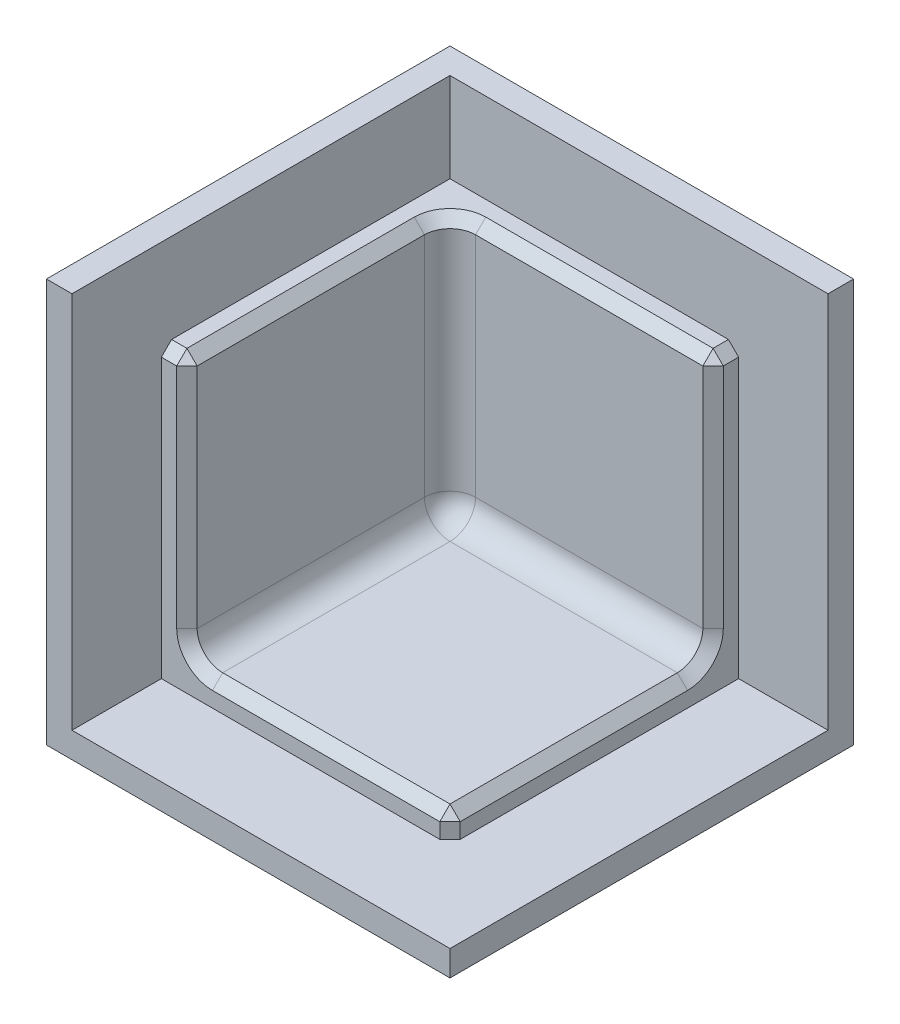
ISO-10303-21;
HEADER;
FILE_DESCRIPTION(('STEP AP214'),'2;1');
FILE_NAME('part.step','',(''),(''),'','','');
FILE_SCHEMA(('AUTOMOTIVE_DESIGN { 1 0 10303 214 1 1 1 1 }'));
ENDSEC;
DATA;
#1=APPLICATION_CONTEXT('core data for automotive mechanical design processes');
#2=APPLICATION_PROTOCOL_DEFINITION('international standard','automotive_design',2000,#1);
#3=PRODUCT_CONTEXT('',#1,'mechanical');
#4=PRODUCT('Part','Part','',(#3));
#5=PRODUCT_RELATED_PRODUCT_CATEGORY('part','',(#4));
#6=PRODUCT_DEFINITION_FORMATION('','',#4);
#7=PRODUCT_DEFINITION_CONTEXT('part definition',#1,'design');
#8=PRODUCT_DEFINITION('design','',#6,#7);
#9=PRODUCT_DEFINITION_SHAPE('','',#8);
#10=(LENGTH_UNIT() NAMED_UNIT(*) SI_UNIT(.MILLI.,.METRE.));
#11=(NAMED_UNIT(*) PLANE_ANGLE_UNIT() SI_UNIT($,.RADIAN.));
#12=(NAMED_UNIT(*) SI_UNIT($,.STERADIAN.) SOLID_ANGLE_UNIT());
#13=UNCERTAINTY_MEASURE_WITH_UNIT(LENGTH_MEASURE(1.E-05),#10,'distance_accuracy_value','');
#14=(GEOMETRIC_REPRESENTATION_CONTEXT(3) GLOBAL_UNCERTAINTY_ASSIGNED_CONTEXT((#13)) GLOBAL_UNIT_ASSIGNED_CONTEXT((#10,
#11,#12)) REPRESENTATION_CONTEXT('',''));
#15=CARTESIAN_POINT('',(0.,0.,0.));
#16=DIRECTION('',(0.,0.,1.));
#17=DIRECTION('',(1.,0.,0.));
#18=AXIS2_PLACEMENT_3D('',#15,#16,#17);
#19=CARTESIAN_POINT('',(7.9,15.8,-7.9));
#20=DIRECTION('',(-1.,0.,0.));
#21=DIRECTION('',(0.,0.,1.));
#22=AXIS2_PLACEMENT_3D('',#19,#20,#21);
#23=PLANE('',#22);
#24=DIRECTION('',(0.,1.,0.));
#25=VECTOR('',#24,1.);
#26=CARTESIAN_POINT('',(7.9,12.3,-6.9));
#27=LINE('',#26,#25);
#28=CARTESIAN_POINT('',(7.9,1.,-6.9));
#29=VERTEX_POINT('',#28);
#30=CARTESIAN_POINT('',(7.9,15.8,-6.9));
#31=VERTEX_POINT('',#30);
#32=EDGE_CURVE('E204',#29,#31,#27,.T.);
#33=ORIENTED_EDGE('',*,*,#32,.F.);
#34=DIRECTION('',(0.,0.,1.));
#35=VECTOR('',#34,1.);
#36=CARTESIAN_POINT('',(7.9,1.,4.4));
#37=LINE('',#36,#35);
#38=CARTESIAN_POINT('',(7.9,1.,7.9));
#39=VERTEX_POINT('',#38);
#40=EDGE_CURVE('E190',#29,#39,#37,.T.);
#41=ORIENTED_EDGE('',*,*,#40,.T.);
#42=DIRECTION('',(0.,-1.,0.));
#43=VECTOR('',#42,1.);
#44=CARTESIAN_POINT('',(7.9,15.8,7.9));
#45=LINE('',#44,#43);
#46=CARTESIAN_POINT('',(7.9,0.,7.9));
#47=VERTEX_POINT('',#46);
#48=EDGE_CURVE('E251',#39,#47,#45,.T.);
#49=ORIENTED_EDGE('',*,*,#48,.T.);
#50=DIRECTION('',(0.,0.,-1.));
#51=VECTOR('',#50,1.);
#52=CARTESIAN_POINT('',(7.9,0.,-7.9));
#53=LINE('',#52,#51);
#54=CARTESIAN_POINT('',(7.9,0.,-7.9));
#55=VERTEX_POINT('',#54);
#56=EDGE_CURVE('E200',#47,#55,#53,.T.);
#57=ORIENTED_EDGE('',*,*,#56,.T.);
#58=DIRECTION('',(0.,-1.,0.));
#59=VECTOR('',#58,1.);
#60=CARTESIAN_POINT('',(7.9,15.8,-7.9));
#61=LINE('',#60,#59);
#62=CARTESIAN_POINT('',(7.9,15.8,-7.9));
#63=VERTEX_POINT('',#62);
#64=EDGE_CURVE('E267',#63,#55,#61,.T.);
#65=ORIENTED_EDGE('',*,*,#64,.F.);
#66=DIRECTION('',(0.,0.,-1.));
#67=VECTOR('',#66,1.);
#68=CARTESIAN_POINT('',(7.9,15.8,-7.9));
#69=LINE('',#68,#67);
#70=EDGE_CURVE('E206',#31,#63,#69,.T.);
#71=ORIENTED_EDGE('',*,*,#70,.F.);
#72=EDGE_LOOP('',(#33,#41,#49,#57,#65,#71));
#73=FACE_BOUND('',#72,.T.);
#74=ADVANCED_FACE('F34',(#73),#23,.F.);
#75=CARTESIAN_POINT('',(-5.9,15.8,-7.9));
#76=DIRECTION('',(1.,0.,0.));
#77=DIRECTION('',(0.,0.,-1.));
#78=AXIS2_PLACEMENT_3D('',#75,#76,#77);
#79=PLANE('',#78);
#80=DIRECTION('',(0.,0.,1.));
#81=VECTOR('',#80,1.);
#82=CARTESIAN_POINT('',(-5.9,11.9,4.4));
#83=LINE('',#82,#81);
#84=CARTESIAN_POINT('',(-5.9,11.9,-4.9));
#85=VERTEX_POINT('',#84);
#86=CARTESIAN_POINT('',(-5.9,11.9,4.));
#87=VERTEX_POINT('',#86);
#88=EDGE_CURVE('E331',#85,#87,#83,.T.);
#89=ORIENTED_EDGE('',*,*,#88,.T.);
#90=DIRECTION('',(0.,-1.,0.));
#91=VECTOR('',#90,1.);
#92=CARTESIAN_POINT('',(-5.9,15.8,4.));
#93=LINE('',#92,#91);
#94=CARTESIAN_POINT('',(-5.9,3.,4.));
#95=VERTEX_POINT('',#94);
#96=EDGE_CURVE('E333',#87,#95,#93,.T.);
#97=ORIENTED_EDGE('',*,*,#96,.T.);
#98=DIRECTION('',(0.,0.,1.));
#99=VECTOR('',#98,1.);
#100=CARTESIAN_POINT('',(-5.9,3.,-5.9));
#101=LINE('',#100,#99);
#102=CARTESIAN_POINT('',(-5.9,3.,-4.9));
#103=VERTEX_POINT('',#102);
#104=EDGE_CURVE('E274',#95,#103,#101,.F.);
#105=ORIENTED_EDGE('',*,*,#104,.T.);
#106=DIRECTION('',(0.,-1.,0.));
#107=VECTOR('',#106,1.);
#108=CARTESIAN_POINT('',(-5.9,12.3,-4.9));
#109=LINE('',#108,#107);
#110=EDGE_CURVE('E276',#103,#85,#109,.F.);
#111=ORIENTED_EDGE('',*,*,#110,.T.);
#112=EDGE_LOOP('',(#89,#97,#105,#111));
#113=FACE_BOUND('',#112,.T.);
#114=ADVANCED_FACE('F416',(#113),#79,.T.);
#115=CARTESIAN_POINT('',(0.,2.,0.));
#116=DIRECTION('',(0.,1.,0.));
#117=DIRECTION('',(0.,0.,1.));
#118=AXIS2_PLACEMENT_3D('',#115,#116,#117);
#119=PLANE('',#118);
#120=DIRECTION('',(0.,0.,1.));
#121=VECTOR('',#120,1.);
#122=CARTESIAN_POINT('',(-4.9,2.,4.4));
#123=LINE('',#122,#121);
#124=CARTESIAN_POINT('',(-4.9,2.,-4.9));
#125=VERTEX_POINT('',#124);
#126=CARTESIAN_POINT('',(-4.9,2.,4.));
#127=VERTEX_POINT('',#126);
#128=EDGE_CURVE('E279',#125,#127,#123,.T.);
#129=ORIENTED_EDGE('',*,*,#128,.T.);
#130=DIRECTION('',(1.,0.,0.));
#131=VECTOR('',#130,1.);
#132=CARTESIAN_POINT('',(0.,2.,4.));
#133=LINE('',#132,#131);
#134=CARTESIAN_POINT('',(4.,2.,4.));
#135=VERTEX_POINT('',#134);
#136=EDGE_CURVE('E316',#127,#135,#133,.T.);
#137=ORIENTED_EDGE('',*,*,#136,.T.);
#138=DIRECTION('',(0.,0.,-1.));
#139=VECTOR('',#138,1.);
#140=CARTESIAN_POINT('',(4.,2.,-4.9));
#141=LINE('',#140,#139);
#142=CARTESIAN_POINT('',(4.,2.,-4.9));
#143=VERTEX_POINT('',#142);
#144=EDGE_CURVE('E314',#135,#143,#141,.T.);
#145=ORIENTED_EDGE('',*,*,#144,.T.);
#146=DIRECTION('',(-1.,0.,0.));
#147=VECTOR('',#146,1.);
#148=CARTESIAN_POINT('',(-5.9,2.,-4.9));
#149=LINE('',#148,#147);
#150=EDGE_CURVE('E282',#143,#125,#149,.T.);
#151=ORIENTED_EDGE('',*,*,#150,.T.);
#152=EDGE_LOOP('',(#129,#137,#145,#151));
#153=FACE_BOUND('',#152,.T.);
#154=ADVANCED_FACE('F470',(#153),#119,.T.);
#155=CARTESIAN_POINT('',(-7.9,15.8,7.9));
#156=DIRECTION('',(0.,0.,-1.));
#157=DIRECTION('',(-1.,0.,0.));
#158=AXIS2_PLACEMENT_3D('',#155,#156,#157);
#159=PLANE('',#158);
#160=ORIENTED_EDGE('',*,*,#48,.F.);
#161=DIRECTION('',(1.,0.,0.));
#162=VECTOR('',#161,1.);
#163=CARTESIAN_POINT('',(-6.9,1.,7.9));
#164=LINE('',#163,#162);
#165=CARTESIAN_POINT('',(-6.9,1.,7.9));
#166=VERTEX_POINT('',#165);
#167=EDGE_CURVE('E197',#166,#39,#164,.T.);
#168=ORIENTED_EDGE('',*,*,#167,.F.);
#169=DIRECTION('',(0.,-1.,0.));
#170=VECTOR('',#169,1.);
#171=CARTESIAN_POINT('',(-6.9,15.8,7.9));
#172=LINE('',#171,#170);
#173=CARTESIAN_POINT('',(-6.9,15.8,7.9));
#174=VERTEX_POINT('',#173);
#175=EDGE_CURVE('E229',#174,#166,#172,.T.);
#176=ORIENTED_EDGE('',*,*,#175,.F.);
#177=DIRECTION('',(1.,0.,0.));
#178=VECTOR('',#177,1.);
#179=CARTESIAN_POINT('',(-7.9,15.8,7.9));
#180=LINE('',#179,#178);
#181=CARTESIAN_POINT('',(-7.9,15.8,7.9));
#182=VERTEX_POINT('',#181);
#183=EDGE_CURVE('E248',#182,#174,#180,.T.);
#184=ORIENTED_EDGE('',*,*,#183,.F.);
#185=DIRECTION('',(0.,-1.,0.));
#186=VECTOR('',#185,1.);
#187=CARTESIAN_POINT('',(-7.9,15.8,7.9));
#188=LINE('',#187,#186);
#189=CARTESIAN_POINT('',(-7.9,0.,7.9));
#190=VERTEX_POINT('',#189);
#191=EDGE_CURVE('E261',#182,#190,#188,.T.);
#192=ORIENTED_EDGE('',*,*,#191,.T.);
#193=DIRECTION('',(1.,0.,0.));
#194=VECTOR('',#193,1.);
#195=CARTESIAN_POINT('',(-7.9,0.,7.9));
#196=LINE('',#195,#194);
#197=EDGE_CURVE('E244',#190,#47,#196,.T.);
#198=ORIENTED_EDGE('',*,*,#197,.T.);
#199=EDGE_LOOP('',(#160,#168,#176,#184,#192,#198));
#200=FACE_BOUND('',#199,.T.);
#201=ADVANCED_FACE('F656',(#200),#159,.F.);
#202=CARTESIAN_POINT('',(-7.9,15.8,-7.9));
#203=DIRECTION('',(0.,0.,1.));
#204=DIRECTION('',(1.,0.,0.));
#205=AXIS2_PLACEMENT_3D('',#202,#203,#204);
#206=PLANE('',#205);
#207=DIRECTION('',(-1.,0.,0.));
#208=VECTOR('',#207,1.);
#209=CARTESIAN_POINT('',(-7.9,0.,-7.9));
#210=LINE('',#209,#208);
#211=CARTESIAN_POINT('',(-7.9,0.,-7.9));
#212=VERTEX_POINT('',#211);
#213=EDGE_CURVE('E254',#55,#212,#210,.T.);
#214=ORIENTED_EDGE('',*,*,#213,.T.);
#215=DIRECTION('',(0.,-1.,0.));
#216=VECTOR('',#215,1.);
#217=CARTESIAN_POINT('',(-7.9,15.8,-7.9));
#218=LINE('',#217,#216);
#219=CARTESIAN_POINT('',(-7.9,15.8,-7.9));
#220=VERTEX_POINT('',#219);
#221=EDGE_CURVE('E264',#220,#212,#218,.T.);
#222=ORIENTED_EDGE('',*,*,#221,.F.);
#223=DIRECTION('',(-1.,0.,0.));
#224=VECTOR('',#223,1.);
#225=CARTESIAN_POINT('',(-7.9,15.8,-7.9));
#226=LINE('',#225,#224);
#227=EDGE_CURVE('E243',#63,#220,#226,.T.);
#228=ORIENTED_EDGE('',*,*,#227,.F.);
#229=ORIENTED_EDGE('',*,*,#64,.T.);
#230=EDGE_LOOP('',(#214,#222,#228,#229));
#231=FACE_BOUND('',#230,.T.);
#232=ADVANCED_FACE('F474',(#231),#206,.F.);
#233=CARTESIAN_POINT('',(-7.9,15.8,-7.9));
#234=DIRECTION('',(1.,0.,0.));
#235=DIRECTION('',(0.,0.,-1.));
#236=AXIS2_PLACEMENT_3D('',#233,#234,#235);
#237=PLANE('',#236);
#238=DIRECTION('',(0.,0.,1.));
#239=VECTOR('',#238,1.);
#240=CARTESIAN_POINT('',(-7.9,0.,-7.9));
#241=LINE('',#240,#239);
#242=EDGE_CURVE('E256',#212,#190,#241,.T.);
#243=ORIENTED_EDGE('',*,*,#242,.T.);
#244=ORIENTED_EDGE('',*,*,#191,.F.);
#245=DIRECTION('',(0.,0.,1.));
#246=VECTOR('',#245,1.);
#247=CARTESIAN_POINT('',(-7.9,15.8,-7.9));
#248=LINE('',#247,#246);
#249=EDGE_CURVE('E246',#220,#182,#248,.T.);
#250=ORIENTED_EDGE('',*,*,#249,.F.);
#251=ORIENTED_EDGE('',*,*,#221,.T.);
#252=EDGE_LOOP('',(#243,#244,#250,#251));
#253=FACE_BOUND('',#252,.T.);
#254=ADVANCED_FACE('F643',(#253),#237,.F.);
#255=CARTESIAN_POINT('',(0.,15.8,0.));
#256=DIRECTION('',(0.,1.,0.));
#257=DIRECTION('',(0.,0.,1.));
#258=AXIS2_PLACEMENT_3D('',#255,#256,#257);
#259=PLANE('',#258);
#260=DIRECTION('',(0.,0.,1.));
#261=VECTOR('',#260,1.);
#262=CARTESIAN_POINT('',(-6.9,15.8,4.4));
#263=LINE('',#262,#261);
#264=CARTESIAN_POINT('',(-6.9,15.8,-6.9));
#265=VERTEX_POINT('',#264);
#266=EDGE_CURVE('E236',#265,#174,#263,.T.);
#267=ORIENTED_EDGE('',*,*,#266,.F.);
#268=DIRECTION('',(-1.,0.,0.));
#269=VECTOR('',#268,1.);
#270=CARTESIAN_POINT('',(-6.9,15.8,-6.9));
#271=LINE('',#270,#269);
#272=EDGE_CURVE('E217',#31,#265,#271,.T.);
#273=ORIENTED_EDGE('',*,*,#272,.F.);
#274=ORIENTED_EDGE('',*,*,#70,.T.);
#275=ORIENTED_EDGE('',*,*,#227,.T.);
#276=ORIENTED_EDGE('',*,*,#249,.T.);
#277=ORIENTED_EDGE('',*,*,#183,.T.);
#278=EDGE_LOOP('',(#267,#273,#274,#275,#276,#277));
#279=FACE_BOUND('',#278,.T.);
#280=ADVANCED_FACE('F633',(#279),#259,.T.);
#281=CARTESIAN_POINT('',(0.,0.,0.));
#282=DIRECTION('',(0.,1.,0.));
#283=DIRECTION('',(0.,0.,1.));
#284=AXIS2_PLACEMENT_3D('',#281,#282,#283);
#285=PLANE('',#284);
#286=ORIENTED_EDGE('',*,*,#56,.F.);
#287=ORIENTED_EDGE('',*,*,#197,.F.);
#288=ORIENTED_EDGE('',*,*,#242,.F.);
#289=ORIENTED_EDGE('',*,*,#213,.F.);
#290=EDGE_LOOP('',(#286,#287,#288,#289));
#291=FACE_BOUND('',#290,.T.);
#292=ADVANCED_FACE('F625',(#291),#285,.F.);
#293=CARTESIAN_POINT('',(-7.9,15.8,-5.9));
#294=DIRECTION('',(0.,0.,1.));
#295=DIRECTION('',(1.,0.,0.));
#296=AXIS2_PLACEMENT_3D('',#293,#294,#295);
#297=PLANE('',#296);
#298=DIRECTION('',(-1.,0.,0.));
#299=VECTOR('',#298,1.);
#300=CARTESIAN_POINT('',(4.4,3.,-5.9));
#301=LINE('',#300,#299);
#302=CARTESIAN_POINT('',(-4.9,3.,-5.9));
#303=VERTEX_POINT('',#302);
#304=CARTESIAN_POINT('',(4.,3.,-5.9));
#305=VERTEX_POINT('',#304);
#306=EDGE_CURVE('E270',#303,#305,#301,.F.);
#307=ORIENTED_EDGE('',*,*,#306,.T.);
#308=DIRECTION('',(0.,1.,0.));
#309=VECTOR('',#308,1.);
#310=CARTESIAN_POINT('',(4.,12.3,-5.9));
#311=LINE('',#310,#309);
#312=CARTESIAN_POINT('',(4.,11.9,-5.9));
#313=VERTEX_POINT('',#312);
#314=EDGE_CURVE('E52',#305,#313,#311,.T.);
#315=ORIENTED_EDGE('',*,*,#314,.T.);
#316=DIRECTION('',(-1.,0.,0.));
#317=VECTOR('',#316,1.);
#318=CARTESIAN_POINT('',(-4.9,11.9,-5.9));
#319=LINE('',#318,#317);
#320=CARTESIAN_POINT('',(-4.9,11.9,-5.9));
#321=VERTEX_POINT('',#320);
#322=EDGE_CURVE('E56',#313,#321,#319,.T.);
#323=ORIENTED_EDGE('',*,*,#322,.T.);
#324=DIRECTION('',(0.,-1.,0.));
#325=VECTOR('',#324,1.);
#326=CARTESIAN_POINT('',(-4.9,2.,-5.9));
#327=LINE('',#326,#325);
#328=EDGE_CURVE('E272',#321,#303,#327,.T.);
#329=ORIENTED_EDGE('',*,*,#328,.T.);
#330=EDGE_LOOP('',(#307,#315,#323,#329));
#331=FACE_BOUND('',#330,.T.);
#332=ADVANCED_FACE('F433',(#331),#297,.T.);
#333=CARTESIAN_POINT('',(-6.9,1.,4.4));
#334=DIRECTION('',(0.,-1.,0.));
#335=DIRECTION('',(0.,0.,-1.));
#336=AXIS2_PLACEMENT_3D('',#333,#334,#335);
#337=PLANE('',#336);
#338=ORIENTED_EDGE('',*,*,#167,.T.);
#339=ORIENTED_EDGE('',*,*,#40,.F.);
#340=DIRECTION('',(-1.,0.,0.));
#341=VECTOR('',#340,1.);
#342=CARTESIAN_POINT('',(59.3580034494853,1.,-6.90000000000001));
#343=LINE('',#342,#341);
#344=CARTESIAN_POINT('',(4.4,1.,-6.9));
#345=VERTEX_POINT('',#344);
#346=EDGE_CURVE('E195',#29,#345,#343,.T.);
#347=ORIENTED_EDGE('',*,*,#346,.T.);
#348=DIRECTION('',(0.,0.,1.));
#349=VECTOR('',#348,1.);
#350=CARTESIAN_POINT('',(4.4,1.,4.4));
#351=LINE('',#350,#349);
#352=CARTESIAN_POINT('',(4.4,1.,4.));
#353=VERTEX_POINT('',#352);
#354=EDGE_CURVE('E221',#345,#353,#351,.T.);
#355=ORIENTED_EDGE('',*,*,#354,.T.);
#356=DIRECTION('',(-0.707106781186544,0.,0.707106781186551));
#357=VECTOR('',#356,1.);
#358=CARTESIAN_POINT('',(-1.44999999999995,1.,9.85));
#359=LINE('',#358,#357);
#360=CARTESIAN_POINT('',(4.,1.,4.4));
#361=VERTEX_POINT('',#360);
#362=EDGE_CURVE('E341',#353,#361,#359,.T.);
#363=ORIENTED_EDGE('',*,*,#362,.T.);
#364=DIRECTION('',(1.,0.,0.));
#365=VECTOR('',#364,1.);
#366=CARTESIAN_POINT('',(-6.9,1.,4.4));
#367=LINE('',#366,#365);
#368=CARTESIAN_POINT('',(-6.9,1.,4.4));
#369=VERTEX_POINT('',#368);
#370=EDGE_CURVE('E233',#369,#361,#367,.T.);
#371=ORIENTED_EDGE('',*,*,#370,.F.);
#372=DIRECTION('',(0.,0.,1.));
#373=VECTOR('',#372,1.);
#374=CARTESIAN_POINT('',(-6.9,1.,4.4));
#375=LINE('',#374,#373);
#376=EDGE_CURVE('E201',#369,#166,#375,.T.);
#377=ORIENTED_EDGE('',*,*,#376,.T.);
#378=EDGE_LOOP('',(#338,#339,#347,#355,#363,#371,#377));
#379=FACE_BOUND('',#378,.T.);
#380=ADVANCED_FACE('F192',(#379),#337,.F.);
#381=CARTESIAN_POINT('',(-6.9,15.8,4.4));
#382=DIRECTION('',(-1.,0.,0.));
#383=DIRECTION('',(0.,-1.,0.));
#384=AXIS2_PLACEMENT_3D('',#381,#382,#383);
#385=PLANE('',#384);
#386=ORIENTED_EDGE('',*,*,#175,.T.);
#387=ORIENTED_EDGE('',*,*,#376,.F.);
#388=DIRECTION('',(0.,-1.,0.));
#389=VECTOR('',#388,1.);
#390=CARTESIAN_POINT('',(-6.9,15.8,4.4));
#391=LINE('',#390,#389);
#392=CARTESIAN_POINT('',(-6.9,11.9,4.4));
#393=VERTEX_POINT('',#392);
#394=EDGE_CURVE('E231',#393,#369,#391,.T.);
#395=ORIENTED_EDGE('',*,*,#394,.F.);
#396=DIRECTION('',(0.,0.707106781186548,-0.707106781186548));
#397=VECTOR('',#396,1.);
#398=CARTESIAN_POINT('',(-6.9,13.85,2.45));
#399=LINE('',#398,#397);
#400=CARTESIAN_POINT('',(-6.9,12.3,4.));
#401=VERTEX_POINT('',#400);
#402=EDGE_CURVE('E44',#393,#401,#399,.T.);
#403=ORIENTED_EDGE('',*,*,#402,.T.);
#404=DIRECTION('',(0.,0.,1.));
#405=VECTOR('',#404,1.);
#406=CARTESIAN_POINT('',(-6.9,12.3,4.4));
#407=LINE('',#406,#405);
#408=CARTESIAN_POINT('',(-6.9,12.3,-6.9));
#409=VERTEX_POINT('',#408);
#410=EDGE_CURVE('E211',#409,#401,#407,.T.);
#411=ORIENTED_EDGE('',*,*,#410,.F.);
#412=DIRECTION('',(0.,1.,0.));
#413=VECTOR('',#412,1.);
#414=CARTESIAN_POINT('',(-6.9,12.3,-6.9));
#415=LINE('',#414,#413);
#416=EDGE_CURVE('E210',#409,#265,#415,.T.);
#417=ORIENTED_EDGE('',*,*,#416,.T.);
#418=ORIENTED_EDGE('',*,*,#266,.T.);
#419=EDGE_LOOP('',(#386,#387,#395,#403,#411,#417,#418));
#420=FACE_BOUND('',#419,.T.);
#421=ADVANCED_FACE('F604',(#420),#385,.F.);
#422=CARTESIAN_POINT('',(0.,0.,4.4));
#423=DIRECTION('',(0.,0.,1.));
#424=DIRECTION('',(1.,0.,0.));
#425=AXIS2_PLACEMENT_3D('',#422,#423,#424);
#426=PLANE('',#425);
#427=ORIENTED_EDGE('',*,*,#370,.T.);
#428=DIRECTION('',(0.,1.,0.));
#429=VECTOR('',#428,1.);
#430=CARTESIAN_POINT('',(4.,2.,4.4));
#431=LINE('',#430,#429);
#432=CARTESIAN_POINT('',(4.,1.6,4.4));
#433=VERTEX_POINT('',#432);
#434=EDGE_CURVE('E301',#361,#433,#431,.T.);
#435=ORIENTED_EDGE('',*,*,#434,.T.);
#436=DIRECTION('',(-1.,0.,0.));
#437=VECTOR('',#436,1.);
#438=CARTESIAN_POINT('',(0.,1.6,4.4));
#439=LINE('',#438,#437);
#440=CARTESIAN_POINT('',(-4.9,1.6,4.4));
#441=VERTEX_POINT('',#440);
#442=EDGE_CURVE('E299',#433,#441,#439,.T.);
#443=ORIENTED_EDGE('',*,*,#442,.T.);
#444=CARTESIAN_POINT('',(-4.9,3.,4.4));
#445=DIRECTION('',(0.,0.,1.));
#446=DIRECTION('',(1.,0.,0.));
#447=AXIS2_PLACEMENT_3D('',#444,#445,#446);
#448=CIRCLE('',#447,1.4);
#449=CARTESIAN_POINT('',(-6.30000000000001,3.,4.4));
#450=VERTEX_POINT('',#449);
#451=EDGE_CURVE('E297',#441,#450,#448,.F.);
#452=ORIENTED_EDGE('',*,*,#451,.T.);
#453=DIRECTION('',(0.,1.,0.));
#454=VECTOR('',#453,1.);
#455=CARTESIAN_POINT('',(-6.30000000000001,0.,4.4));
#456=LINE('',#455,#454);
#457=CARTESIAN_POINT('',(-6.30000000000001,11.9,4.4));
#458=VERTEX_POINT('',#457);
#459=EDGE_CURVE('E284',#450,#458,#456,.T.);
#460=ORIENTED_EDGE('',*,*,#459,.T.);
#461=DIRECTION('',(-1.,0.,0.));
#462=VECTOR('',#461,1.);
#463=CARTESIAN_POINT('',(-6.9,11.9,4.4));
#464=LINE('',#463,#462);
#465=EDGE_CURVE('E295',#458,#393,#464,.T.);
#466=ORIENTED_EDGE('',*,*,#465,.T.);
#467=ORIENTED_EDGE('',*,*,#394,.T.);
#468=EDGE_LOOP('',(#427,#435,#443,#452,#460,#466,#467));
#469=FACE_BOUND('',#468,.T.);
#470=ADVANCED_FACE('F597',(#469),#426,.T.);
#471=CARTESIAN_POINT('',(-6.9,12.3,-6.9));
#472=DIRECTION('',(0.,0.,-1.));
#473=DIRECTION('',(-1.,0.,0.));
#474=AXIS2_PLACEMENT_3D('',#471,#472,#473);
#475=PLANE('',#474);
#476=ORIENTED_EDGE('',*,*,#272,.T.);
#477=ORIENTED_EDGE('',*,*,#416,.F.);
#478=DIRECTION('',(-1.,0.,0.));
#479=VECTOR('',#478,1.);
#480=CARTESIAN_POINT('',(-6.9,12.3,-6.9));
#481=LINE('',#480,#479);
#482=CARTESIAN_POINT('',(4.,12.3,-6.9));
#483=VERTEX_POINT('',#482);
#484=EDGE_CURVE('E219',#483,#409,#481,.T.);
#485=ORIENTED_EDGE('',*,*,#484,.F.);
#486=DIRECTION('',(-0.707106781186548,0.707106781186548,0.));
#487=VECTOR('',#486,1.);
#488=CARTESIAN_POINT('',(-1.45,17.75,-6.9));
#489=LINE('',#488,#487);
#490=CARTESIAN_POINT('',(4.4,11.9,-6.9));
#491=VERTEX_POINT('',#490);
#492=EDGE_CURVE('E11',#483,#491,#489,.F.);
#493=ORIENTED_EDGE('',*,*,#492,.T.);
#494=DIRECTION('',(0.,-1.,0.));
#495=VECTOR('',#494,1.);
#496=CARTESIAN_POINT('',(4.4,1.,-6.9));
#497=LINE('',#496,#495);
#498=EDGE_CURVE('E215',#491,#345,#497,.T.);
#499=ORIENTED_EDGE('',*,*,#498,.T.);
#500=ORIENTED_EDGE('',*,*,#346,.F.);
#501=ORIENTED_EDGE('',*,*,#32,.T.);
#502=EDGE_LOOP('',(#476,#477,#485,#493,#499,#500,#501));
#503=FACE_BOUND('',#502,.T.);
#504=ADVANCED_FACE('F213',(#503),#475,.F.);
#505=CARTESIAN_POINT('',(0.,12.3,0.));
#506=DIRECTION('',(0.,-1.,0.));
#507=DIRECTION('',(0.,0.,-1.));
#508=AXIS2_PLACEMENT_3D('',#505,#506,#507);
#509=PLANE('',#508);
#510=ORIENTED_EDGE('',*,*,#410,.T.);
#511=DIRECTION('',(1.,0.,0.));
#512=VECTOR('',#511,1.);
#513=CARTESIAN_POINT('',(-5.9,12.3,4.));
#514=LINE('',#513,#512);
#515=CARTESIAN_POINT('',(-6.30000000000001,12.3,4.));
#516=VERTEX_POINT('',#515);
#517=EDGE_CURVE('E329',#401,#516,#514,.T.);
#518=ORIENTED_EDGE('',*,*,#517,.T.);
#519=DIRECTION('',(0.,0.,-1.));
#520=VECTOR('',#519,1.);
#521=CARTESIAN_POINT('',(-6.30000000000001,12.3,-4.9));
#522=LINE('',#521,#520);
#523=CARTESIAN_POINT('',(-6.30000000000001,12.3,-4.9));
#524=VERTEX_POINT('',#523);
#525=EDGE_CURVE('E327',#516,#524,#522,.T.);
#526=ORIENTED_EDGE('',*,*,#525,.T.);
#527=CARTESIAN_POINT('',(-4.9,12.3,-4.9));
#528=DIRECTION('',(0.,-1.,0.));
#529=DIRECTION('',(0.,0.,-1.));
#530=AXIS2_PLACEMENT_3D('',#527,#528,#529);
#531=CIRCLE('',#530,1.4);
#532=CARTESIAN_POINT('',(-4.9,12.3,-6.3));
#533=VERTEX_POINT('',#532);
#534=EDGE_CURVE('E325',#524,#533,#531,.T.);
#535=ORIENTED_EDGE('',*,*,#534,.T.);
#536=DIRECTION('',(1.,0.,0.));
#537=VECTOR('',#536,1.);
#538=CARTESIAN_POINT('',(4.4,12.3,-6.3));
#539=LINE('',#538,#537);
#540=CARTESIAN_POINT('',(4.,12.3,-6.3));
#541=VERTEX_POINT('',#540);
#542=EDGE_CURVE('E321',#533,#541,#539,.T.);
#543=ORIENTED_EDGE('',*,*,#542,.T.);
#544=DIRECTION('',(0.,0.,-1.));
#545=VECTOR('',#544,1.);
#546=CARTESIAN_POINT('',(4.,12.3,0.));
#547=LINE('',#546,#545);
#548=EDGE_CURVE('E323',#541,#483,#547,.T.);
#549=ORIENTED_EDGE('',*,*,#548,.T.);
#550=ORIENTED_EDGE('',*,*,#484,.T.);
#551=EDGE_LOOP('',(#510,#518,#526,#535,#543,#549,#550));
#552=FACE_BOUND('',#551,.T.);
#553=ADVANCED_FACE('F397',(#552),#509,.F.);
#554=CARTESIAN_POINT('',(4.4,15.8,-7.9));
#555=DIRECTION('',(-1.,0.,0.));
#556=DIRECTION('',(0.,0.,1.));
#557=AXIS2_PLACEMENT_3D('',#554,#555,#556);
#558=PLANE('',#557);
#559=DIRECTION('',(0.,0.,1.));
#560=VECTOR('',#559,1.);
#561=CARTESIAN_POINT('',(4.4,1.6,4.4));
#562=LINE('',#561,#560);
#563=CARTESIAN_POINT('',(4.4,1.6,-4.9));
#564=VERTEX_POINT('',#563);
#565=CARTESIAN_POINT('',(4.4,1.6,4.));
#566=VERTEX_POINT('',#565);
#567=EDGE_CURVE('E310',#564,#566,#562,.T.);
#568=ORIENTED_EDGE('',*,*,#567,.T.);
#569=DIRECTION('',(0.,-1.,0.));
#570=VECTOR('',#569,1.);
#571=CARTESIAN_POINT('',(4.4,1.,4.));
#572=LINE('',#571,#570);
#573=EDGE_CURVE('E312',#566,#353,#572,.T.);
#574=ORIENTED_EDGE('',*,*,#573,.T.);
#575=ORIENTED_EDGE('',*,*,#354,.F.);
#576=ORIENTED_EDGE('',*,*,#498,.F.);
#577=DIRECTION('',(0.,0.,1.));
#578=VECTOR('',#577,1.);
#579=CARTESIAN_POINT('',(4.4,11.9,-7.9));
#580=LINE('',#579,#578);
#581=CARTESIAN_POINT('',(4.4,11.9,-6.3));
#582=VERTEX_POINT('',#581);
#583=EDGE_CURVE('E306',#491,#582,#580,.T.);
#584=ORIENTED_EDGE('',*,*,#583,.T.);
#585=DIRECTION('',(0.,-1.,0.));
#586=VECTOR('',#585,1.);
#587=CARTESIAN_POINT('',(4.4,3.,-6.3));
#588=LINE('',#587,#586);
#589=CARTESIAN_POINT('',(4.4,3.,-6.3));
#590=VERTEX_POINT('',#589);
#591=EDGE_CURVE('E304',#582,#590,#588,.T.);
#592=ORIENTED_EDGE('',*,*,#591,.T.);
#593=CARTESIAN_POINT('',(4.4,3.,-4.9));
#594=DIRECTION('',(-1.,0.,0.));
#595=DIRECTION('',(0.,0.,1.));
#596=AXIS2_PLACEMENT_3D('',#593,#594,#595);
#597=CIRCLE('',#596,1.4);
#598=EDGE_CURVE('E308',#590,#564,#597,.T.);
#599=ORIENTED_EDGE('',*,*,#598,.T.);
#600=EDGE_LOOP('',(#568,#574,#575,#576,#584,#592,#599));
#601=FACE_BOUND('',#600,.T.);
#602=ADVANCED_FACE('F445',(#601),#558,.F.);
#603=CARTESIAN_POINT('',(0.,3.,-4.9));
#604=DIRECTION('',(1.,0.,0.));
#605=DIRECTION('',(0.,0.,-1.));
#606=AXIS2_PLACEMENT_3D('',#603,#604,#605);
#607=CYLINDRICAL_SURFACE('',#606,1.);
#608=ORIENTED_EDGE('',*,*,#150,.F.);
#609=CARTESIAN_POINT('',(4.,3.,-4.9));
#610=DIRECTION('',(-1.,0.,0.));
#611=DIRECTION('',(0.,0.,1.));
#612=AXIS2_PLACEMENT_3D('',#609,#610,#611);
#613=CIRCLE('',#612,1.);
#614=EDGE_CURVE('E335',#143,#305,#613,.F.);
#615=ORIENTED_EDGE('',*,*,#614,.T.);
#616=ORIENTED_EDGE('',*,*,#306,.F.);
#617=CARTESIAN_POINT('',(-4.9,3.,-4.9));
#618=DIRECTION('',(1.,0.,0.));
#619=DIRECTION('',(0.,0.,-1.));
#620=AXIS2_PLACEMENT_3D('',#617,#618,#619);
#621=CIRCLE('',#620,1.);
#622=EDGE_CURVE('E291',#125,#303,#621,.T.);
#623=ORIENTED_EDGE('',*,*,#622,.F.);
#624=EDGE_LOOP('',(#608,#615,#616,#623));
#625=FACE_BOUND('',#624,.T.);
#626=ADVANCED_FACE('F431',(#625),#607,.F.);
#627=CARTESIAN_POINT('',(-4.9,3.,0.));
#628=DIRECTION('',(0.,0.,-1.));
#629=DIRECTION('',(-1.,0.,0.));
#630=AXIS2_PLACEMENT_3D('',#627,#628,#629);
#631=CYLINDRICAL_SURFACE('',#630,1.);
#632=ORIENTED_EDGE('',*,*,#104,.F.);
#633=CARTESIAN_POINT('',(-4.9,3.,4.));
#634=DIRECTION('',(0.,0.,1.));
#635=DIRECTION('',(1.,0.,0.));
#636=AXIS2_PLACEMENT_3D('',#633,#634,#635);
#637=CIRCLE('',#636,1.);
#638=EDGE_CURVE('E319',#95,#127,#637,.T.);
#639=ORIENTED_EDGE('',*,*,#638,.T.);
#640=ORIENTED_EDGE('',*,*,#128,.F.);
#641=CARTESIAN_POINT('',(-4.9,3.,-4.9));
#642=DIRECTION('',(0.,0.,1.));
#643=DIRECTION('',(1.,0.,0.));
#644=AXIS2_PLACEMENT_3D('',#641,#642,#643);
#645=CIRCLE('',#644,1.);
#646=EDGE_CURVE('E288',#103,#125,#645,.T.);
#647=ORIENTED_EDGE('',*,*,#646,.F.);
#648=EDGE_LOOP('',(#632,#639,#640,#647));
#649=FACE_BOUND('',#648,.T.);
#650=ADVANCED_FACE('F419',(#649),#631,.F.);
#651=CARTESIAN_POINT('',(-4.9,3.,-4.9));
#652=DIRECTION('',(0.,0.,1.));
#653=DIRECTION('',(1.,0.,0.));
#654=AXIS2_PLACEMENT_3D('',#651,#652,#653);
#655=SPHERICAL_SURFACE('',#654,1.);
#656=ORIENTED_EDGE('',*,*,#646,.T.);
#657=ORIENTED_EDGE('',*,*,#622,.T.);
#658=CARTESIAN_POINT('',(-4.9,3.,-4.9));
#659=DIRECTION('',(0.,1.,0.));
#660=DIRECTION('',(0.,0.,1.));
#661=AXIS2_PLACEMENT_3D('',#658,#659,#660);
#662=CIRCLE('',#661,1.);
#663=EDGE_CURVE('E285',#103,#303,#662,.F.);
#664=ORIENTED_EDGE('',*,*,#663,.F.);
#665=EDGE_LOOP('',(#656,#657,#664));
#666=FACE_BOUND('',#665,.T.);
#667=ADVANCED_FACE('F427',(#666),#655,.F.);
#668=CARTESIAN_POINT('',(-4.9,15.8,-4.9));
#669=DIRECTION('',(0.,1.,0.));
#670=DIRECTION('',(0.,0.,1.));
#671=AXIS2_PLACEMENT_3D('',#668,#669,#670);
#672=CYLINDRICAL_SURFACE('',#671,1.);
#673=ORIENTED_EDGE('',*,*,#328,.F.);
#674=CARTESIAN_POINT('',(-4.9,11.9,-4.9));
#675=DIRECTION('',(0.,-1.,0.));
#676=DIRECTION('',(0.,0.,-1.));
#677=AXIS2_PLACEMENT_3D('',#674,#675,#676);
#678=CIRCLE('',#677,1.);
#679=EDGE_CURVE('E337',#321,#85,#678,.F.);
#680=ORIENTED_EDGE('',*,*,#679,.T.);
#681=ORIENTED_EDGE('',*,*,#110,.F.);
#682=ORIENTED_EDGE('',*,*,#663,.T.);
#683=EDGE_LOOP('',(#673,#680,#681,#682));
#684=FACE_BOUND('',#683,.T.);
#685=ADVANCED_FACE('F426',(#684),#672,.F.);
#686=CARTESIAN_POINT('',(-4.9,12.3,-4.9));
#687=DIRECTION('',(0.,1.,0.));
#688=DIRECTION('',(0.,0.,1.));
#689=AXIS2_PLACEMENT_3D('',#686,#687,#688);
#690=CONICAL_SURFACE('',#689,1.4,0.785398163397448);
#691=DIRECTION('',(0.,-0.707106781186547,0.707106781186547));
#692=VECTOR('',#691,1.);
#693=CARTESIAN_POINT('',(-4.9,12.3,-6.3));
#694=LINE('',#693,#692);
#695=EDGE_CURVE('E380',#533,#321,#694,.T.);
#696=ORIENTED_EDGE('',*,*,#695,.F.);
#697=ORIENTED_EDGE('',*,*,#534,.F.);
#698=DIRECTION('',(-0.707106781186547,0.707106781186547,0.));
#699=VECTOR('',#698,1.);
#700=CARTESIAN_POINT('',(-5.9,11.9,-4.9));
#701=LINE('',#700,#699);
#702=EDGE_CURVE('E39',#85,#524,#701,.T.);
#703=ORIENTED_EDGE('',*,*,#702,.F.);
#704=ORIENTED_EDGE('',*,*,#679,.F.);
#705=EDGE_LOOP('',(#696,#697,#703,#704));
#706=FACE_BOUND('',#705,.T.);
#707=ADVANCED_FACE('F37',(#706),#690,.F.);
#708=CARTESIAN_POINT('',(0.,12.3,4.));
#709=DIRECTION('',(0.,0.707106781186547,0.707106781186547));
#710=DIRECTION('',(-1.,0.,0.));
#711=AXIS2_PLACEMENT_3D('',#708,#709,#710);
#712=PLANE('',#711);
#713=ORIENTED_EDGE('',*,*,#402,.F.);
#714=ORIENTED_EDGE('',*,*,#465,.F.);
#715=DIRECTION('',(0.,-0.707106781186547,0.707106781186547));
#716=VECTOR('',#715,1.);
#717=CARTESIAN_POINT('',(-6.30000000000001,12.3,4.));
#718=LINE('',#717,#716);
#719=EDGE_CURVE('E378',#516,#458,#718,.T.);
#720=ORIENTED_EDGE('',*,*,#719,.F.);
#721=ORIENTED_EDGE('',*,*,#517,.F.);
#722=EDGE_LOOP('',(#713,#714,#720,#721));
#723=FACE_BOUND('',#722,.T.);
#724=ADVANCED_FACE('F403',(#723),#712,.T.);
#725=CARTESIAN_POINT('',(-6.30000000000001,12.3,0.));
#726=DIRECTION('',(0.707106781186547,0.707106781186547,0.));
#727=DIRECTION('',(0.,0.,1.));
#728=AXIS2_PLACEMENT_3D('',#725,#726,#727);
#729=PLANE('',#728);
#730=ORIENTED_EDGE('',*,*,#702,.T.);
#731=ORIENTED_EDGE('',*,*,#525,.F.);
#732=DIRECTION('',(-0.707106781186547,0.707106781186547,0.));
#733=VECTOR('',#732,1.);
#734=CARTESIAN_POINT('',(-6.30000000000001,12.3,4.));
#735=LINE('',#734,#733);
#736=EDGE_CURVE('E375',#87,#516,#735,.T.);
#737=ORIENTED_EDGE('',*,*,#736,.F.);
#738=ORIENTED_EDGE('',*,*,#88,.F.);
#739=EDGE_LOOP('',(#730,#731,#737,#738));
#740=FACE_BOUND('',#739,.T.);
#741=ADVANCED_FACE('F390',(#740),#729,.T.);
#742=CARTESIAN_POINT('',(0.,12.3,-6.3));
#743=DIRECTION('',(0.,0.707106781186547,0.707106781186547));
#744=DIRECTION('',(-1.,0.,0.));
#745=AXIS2_PLACEMENT_3D('',#742,#743,#744);
#746=PLANE('',#745);
#747=ORIENTED_EDGE('',*,*,#695,.T.);
#748=ORIENTED_EDGE('',*,*,#322,.F.);
#749=DIRECTION('',(0.,-0.707106781186547,0.707106781186547));
#750=VECTOR('',#749,1.);
#751=CARTESIAN_POINT('',(4.,12.1,-6.1));
#752=LINE('',#751,#750);
#753=EDGE_CURVE('E372',#541,#313,#752,.T.);
#754=ORIENTED_EDGE('',*,*,#753,.F.);
#755=ORIENTED_EDGE('',*,*,#542,.F.);
#756=EDGE_LOOP('',(#747,#748,#754,#755));
#757=FACE_BOUND('',#756,.T.);
#758=ADVANCED_FACE('F455',(#757),#746,.T.);
#759=CARTESIAN_POINT('',(4.,12.3,0.));
#760=DIRECTION('',(-0.707106781186547,-0.707106781186547,0.));
#761=DIRECTION('',(0.,0.,-1.));
#762=AXIS2_PLACEMENT_3D('',#759,#760,#761);
#763=PLANE('',#762);
#764=ORIENTED_EDGE('',*,*,#492,.F.);
#765=ORIENTED_EDGE('',*,*,#548,.F.);
#766=DIRECTION('',(0.707106781186547,-0.707106781186547,0.));
#767=VECTOR('',#766,1.);
#768=CARTESIAN_POINT('',(4.4,11.9,-6.3));
#769=LINE('',#768,#767);
#770=EDGE_CURVE('E369',#582,#541,#769,.F.);
#771=ORIENTED_EDGE('',*,*,#770,.F.);
#772=ORIENTED_EDGE('',*,*,#583,.F.);
#773=EDGE_LOOP('',(#764,#765,#771,#772));
#774=FACE_BOUND('',#773,.T.);
#775=ADVANCED_FACE('F451',(#774),#763,.F.);
#776=CARTESIAN_POINT('',(-6.30000000000001,12.3,4.));
#777=DIRECTION('',(0.577350269189626,0.577350269189626,0.577350269189626));
#778=DIRECTION('',(0.707106781186547,0.,-0.707106781186547));
#779=AXIS2_PLACEMENT_3D('',#776,#777,#778);
#780=PLANE('',#779);
#781=ORIENTED_EDGE('',*,*,#736,.T.);
#782=ORIENTED_EDGE('',*,*,#719,.T.);
#783=DIRECTION('',(-0.707106781186547,0.,0.707106781186547));
#784=VECTOR('',#783,1.);
#785=CARTESIAN_POINT('',(-6.1,11.9,4.2));
#786=LINE('',#785,#784);
#787=EDGE_CURVE('E366',#87,#458,#786,.T.);
#788=ORIENTED_EDGE('',*,*,#787,.F.);
#789=EDGE_LOOP('',(#781,#782,#788));
#790=FACE_BOUND('',#789,.T.);
#791=ADVANCED_FACE('F407',(#790),#780,.T.);
#792=CARTESIAN_POINT('',(4.4,11.9,-6.3));
#793=DIRECTION('',(0.577350269189626,0.577350269189626,0.577350269189626));
#794=DIRECTION('',(0.707106781186547,0.,-0.707106781186547));
#795=AXIS2_PLACEMENT_3D('',#792,#793,#794);
#796=PLANE('',#795);
#797=ORIENTED_EDGE('',*,*,#770,.T.);
#798=ORIENTED_EDGE('',*,*,#753,.T.);
#799=DIRECTION('',(0.707106781186547,0.,-0.707106781186547));
#800=VECTOR('',#799,1.);
#801=CARTESIAN_POINT('',(4.4,11.9,-6.3));
#802=LINE('',#801,#800);
#803=EDGE_CURVE('E363',#582,#313,#802,.F.);
#804=ORIENTED_EDGE('',*,*,#803,.F.);
#805=EDGE_LOOP('',(#797,#798,#804));
#806=FACE_BOUND('',#805,.T.);
#807=ADVANCED_FACE('F454',(#806),#796,.T.);
#808=CARTESIAN_POINT('',(-5.9,15.8,4.));
#809=DIRECTION('',(-0.707106781186547,0.,-0.707106781186547));
#810=DIRECTION('',(0.,-1.,0.));
#811=AXIS2_PLACEMENT_3D('',#808,#809,#810);
#812=PLANE('',#811);
#813=ORIENTED_EDGE('',*,*,#787,.T.);
#814=ORIENTED_EDGE('',*,*,#459,.F.);
#815=DIRECTION('',(-0.707106781186547,0.,0.707106781186547));
#816=VECTOR('',#815,1.);
#817=CARTESIAN_POINT('',(-5.9,3.,4.));
#818=LINE('',#817,#816);
#819=EDGE_CURVE('E360',#95,#450,#818,.T.);
#820=ORIENTED_EDGE('',*,*,#819,.F.);
#821=ORIENTED_EDGE('',*,*,#96,.F.);
#822=EDGE_LOOP('',(#813,#814,#820,#821));
#823=FACE_BOUND('',#822,.T.);
#824=ADVANCED_FACE('F412',(#823),#812,.F.);
#825=CARTESIAN_POINT('',(4.,15.8,-5.9));
#826=DIRECTION('',(0.707106781186547,0.,0.707106781186547));
#827=DIRECTION('',(0.,-1.,0.));
#828=AXIS2_PLACEMENT_3D('',#825,#826,#827);
#829=PLANE('',#828);
#830=ORIENTED_EDGE('',*,*,#803,.T.);
#831=ORIENTED_EDGE('',*,*,#314,.F.);
#832=DIRECTION('',(-0.707106781186547,0.,0.707106781186547));
#833=VECTOR('',#832,1.);
#834=CARTESIAN_POINT('',(4.4,3.,-6.3));
#835=LINE('',#834,#833);
#836=EDGE_CURVE('E357',#590,#305,#835,.T.);
#837=ORIENTED_EDGE('',*,*,#836,.F.);
#838=ORIENTED_EDGE('',*,*,#591,.F.);
#839=EDGE_LOOP('',(#830,#831,#837,#838));
#840=FACE_BOUND('',#839,.T.);
#841=ADVANCED_FACE('F436',(#840),#829,.T.);
#842=CARTESIAN_POINT('',(-4.9,3.,4.4));
#843=DIRECTION('',(0.,0.,1.));
#844=DIRECTION('',(1.,0.,0.));
#845=AXIS2_PLACEMENT_3D('',#842,#843,#844);
#846=CONICAL_SURFACE('',#845,1.4,0.785398163397448);
#847=ORIENTED_EDGE('',*,*,#819,.T.);
#848=ORIENTED_EDGE('',*,*,#451,.F.);
#849=DIRECTION('',(0.,-0.707106781186547,0.707106781186547));
#850=VECTOR('',#849,1.);
#851=CARTESIAN_POINT('',(-4.9,2.,4.));
#852=LINE('',#851,#850);
#853=EDGE_CURVE('E354',#127,#441,#852,.T.);
#854=ORIENTED_EDGE('',*,*,#853,.F.);
#855=ORIENTED_EDGE('',*,*,#638,.F.);
#856=EDGE_LOOP('',(#847,#848,#854,#855));
#857=FACE_BOUND('',#856,.T.);
#858=ADVANCED_FACE('F518',(#857),#846,.F.);
#859=CARTESIAN_POINT('',(4.4,3.,-4.9));
#860=DIRECTION('',(1.,0.,0.));
#861=DIRECTION('',(0.,0.,-1.));
#862=AXIS2_PLACEMENT_3D('',#859,#860,#861);
#863=CONICAL_SURFACE('',#862,1.4,0.785398163397448);
#864=ORIENTED_EDGE('',*,*,#836,.T.);
#865=ORIENTED_EDGE('',*,*,#614,.F.);
#866=DIRECTION('',(-0.707106781186548,0.707106781186547,0.));
#867=VECTOR('',#866,1.);
#868=CARTESIAN_POINT('',(4.4,1.6,-4.9));
#869=LINE('',#868,#867);
#870=EDGE_CURVE('E351',#564,#143,#869,.T.);
#871=ORIENTED_EDGE('',*,*,#870,.F.);
#872=ORIENTED_EDGE('',*,*,#598,.F.);
#873=EDGE_LOOP('',(#864,#865,#871,#872));
#874=FACE_BOUND('',#873,.T.);
#875=ADVANCED_FACE('F441',(#874),#863,.F.);
#876=CARTESIAN_POINT('',(0.,1.6,4.4));
#877=DIRECTION('',(0.,-0.707106781186544,-0.707106781186551));
#878=DIRECTION('',(-1.,0.,0.));
#879=AXIS2_PLACEMENT_3D('',#876,#877,#878);
#880=PLANE('',#879);
#881=ORIENTED_EDGE('',*,*,#853,.T.);
#882=ORIENTED_EDGE('',*,*,#442,.F.);
#883=DIRECTION('',(0.,0.707106781186551,-0.707106781186544));
#884=VECTOR('',#883,1.);
#885=CARTESIAN_POINT('',(4.,1.6,4.4));
#886=LINE('',#885,#884);
#887=EDGE_CURVE('E348',#135,#433,#886,.F.);
#888=ORIENTED_EDGE('',*,*,#887,.F.);
#889=ORIENTED_EDGE('',*,*,#136,.F.);
#890=EDGE_LOOP('',(#881,#882,#888,#889));
#891=FACE_BOUND('',#890,.T.);
#892=ADVANCED_FACE('F505',(#891),#880,.F.);
#893=CARTESIAN_POINT('',(4.,2.,0.));
#894=DIRECTION('',(0.707106781186551,0.707106781186544,0.));
#895=DIRECTION('',(0.,0.,1.));
#896=AXIS2_PLACEMENT_3D('',#893,#894,#895);
#897=PLANE('',#896);
#898=ORIENTED_EDGE('',*,*,#870,.T.);
#899=ORIENTED_EDGE('',*,*,#144,.F.);
#900=DIRECTION('',(-0.707106781186545,0.707106781186551,0.));
#901=VECTOR('',#900,1.);
#902=CARTESIAN_POINT('',(4.2,1.8,4.));
#903=LINE('',#902,#901);
#904=EDGE_CURVE('E346',#566,#135,#903,.T.);
#905=ORIENTED_EDGE('',*,*,#904,.F.);
#906=ORIENTED_EDGE('',*,*,#567,.F.);
#907=EDGE_LOOP('',(#898,#899,#905,#906));
#908=FACE_BOUND('',#907,.T.);
#909=ADVANCED_FACE('F498',(#908),#897,.T.);
#910=CARTESIAN_POINT('',(4.,1.6,4.4));
#911=DIRECTION('',(0.577350269189631,0.577350269189621,0.577350269189626));
#912=DIRECTION('',(0.707106781186544,0.,-0.70710678118655));
#913=AXIS2_PLACEMENT_3D('',#910,#911,#912);
#914=PLANE('',#913);
#915=ORIENTED_EDGE('',*,*,#904,.T.);
#916=ORIENTED_EDGE('',*,*,#887,.T.);
#917=DIRECTION('',(0.707106781186545,0.,-0.707106781186551));
#918=VECTOR('',#917,1.);
#919=CARTESIAN_POINT('',(4.,1.6,4.4));
#920=LINE('',#919,#918);
#921=EDGE_CURVE('E344',#566,#433,#920,.F.);
#922=ORIENTED_EDGE('',*,*,#921,.F.);
#923=EDGE_LOOP('',(#915,#916,#922));
#924=FACE_BOUND('',#923,.T.);
#925=ADVANCED_FACE('F491',(#924),#914,.T.);
#926=CARTESIAN_POINT('',(4.,0.,4.4));
#927=DIRECTION('',(0.707106781186551,0.,0.707106781186544));
#928=DIRECTION('',(0.,-1.,0.));
#929=AXIS2_PLACEMENT_3D('',#926,#927,#928);
#930=PLANE('',#929);
#931=ORIENTED_EDGE('',*,*,#362,.F.);
#932=ORIENTED_EDGE('',*,*,#573,.F.);
#933=ORIENTED_EDGE('',*,*,#921,.T.);
#934=ORIENTED_EDGE('',*,*,#434,.F.);
#935=EDGE_LOOP('',(#931,#932,#933,#934));
#936=FACE_BOUND('',#935,.T.);
#937=ADVANCED_FACE('F485',(#936),#930,.T.);
#938=CLOSED_SHELL('',(#74,#114,#154,#201,#232,#254,#280,#292,#332,#380,#421,#470,#504,#553,#602,
#626,#650,#667,#685,#707,#724,#741,#758,#775,#791,#807,#824,#841,#858,#875,#892,#909,#925,#937));
#939=MANIFOLD_SOLID_BREP('B2',#938);
#940=ADVANCED_BREP_SHAPE_REPRESENTATION('',(#18,#939),#14);
#941=SHAPE_DEFINITION_REPRESENTATION(#9,#940);
ENDSEC;
END-ISO-10303-21;
